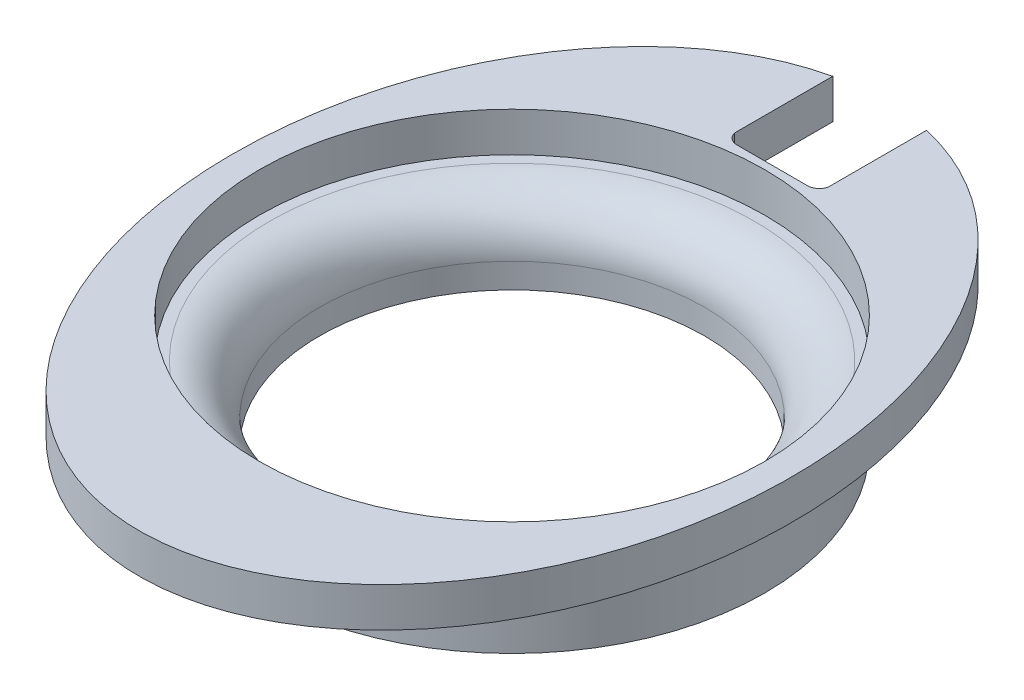
ISO-10303-21;
HEADER;
FILE_DESCRIPTION(('STEP AP214'),'2;1');
FILE_NAME('part.step','',(''),(''),'','','');
FILE_SCHEMA(('AUTOMOTIVE_DESIGN { 1 0 10303 214 1 1 1 1 }'));
ENDSEC;
DATA;
#1=APPLICATION_CONTEXT('core data for automotive mechanical design processes');
#2=APPLICATION_PROTOCOL_DEFINITION('international standard','automotive_design',2000,#1);
#3=PRODUCT_CONTEXT('',#1,'mechanical');
#4=PRODUCT('Part','Part','',(#3));
#5=PRODUCT_RELATED_PRODUCT_CATEGORY('part','',(#4));
#6=PRODUCT_DEFINITION_FORMATION('','',#4);
#7=PRODUCT_DEFINITION_CONTEXT('part definition',#1,'design');
#8=PRODUCT_DEFINITION('design','',#6,#7);
#9=PRODUCT_DEFINITION_SHAPE('','',#8);
#10=(LENGTH_UNIT() NAMED_UNIT(*) SI_UNIT(.MILLI.,.METRE.));
#11=(NAMED_UNIT(*) PLANE_ANGLE_UNIT() SI_UNIT($,.RADIAN.));
#12=(NAMED_UNIT(*) SI_UNIT($,.STERADIAN.) SOLID_ANGLE_UNIT());
#13=UNCERTAINTY_MEASURE_WITH_UNIT(LENGTH_MEASURE(1.E-05),#10,'distance_accuracy_value','');
#14=(GEOMETRIC_REPRESENTATION_CONTEXT(3) GLOBAL_UNCERTAINTY_ASSIGNED_CONTEXT((#13)) GLOBAL_UNIT_ASSIGNED_CONTEXT((#10,
#11,#12)) REPRESENTATION_CONTEXT('',''));
#15=CARTESIAN_POINT('',(0.,0.,0.));
#16=DIRECTION('',(0.,0.,1.));
#17=DIRECTION('',(1.,0.,0.));
#18=AXIS2_PLACEMENT_3D('',#15,#16,#17);
#19=CARTESIAN_POINT('',(0.,-6.,0.));
#20=DIRECTION('',(0.,1.,0.));
#21=DIRECTION('',(0.,0.,1.));
#22=AXIS2_PLACEMENT_3D('',#19,#20,#21);
#23=CYLINDRICAL_SURFACE('',#22,20.335);
#24=CARTESIAN_POINT('',(0.,-6.,0.));
#25=DIRECTION('',(0.,1.,0.));
#26=DIRECTION('',(0.,0.,1.));
#27=AXIS2_PLACEMENT_3D('',#24,#25,#26);
#28=CIRCLE('',#27,20.335);
#29=CARTESIAN_POINT('',(0.,-6.,20.335));
#30=VERTEX_POINT('',#29);
#31=EDGE_CURVE('E63',#30,#30,#28,.T.);
#32=ORIENTED_EDGE('',*,*,#31,.T.);
#33=EDGE_LOOP('',(#32));
#34=FACE_BOUND('',#33,.T.);
#35=CARTESIAN_POINT('',(0.,0.,0.));
#36=DIRECTION('',(0.,1.,0.));
#37=DIRECTION('',(0.,0.,1.));
#38=AXIS2_PLACEMENT_3D('',#35,#36,#37);
#39=CIRCLE('',#38,20.335);
#40=CARTESIAN_POINT('',(0.,0.,20.335));
#41=VERTEX_POINT('',#40);
#42=EDGE_CURVE('E67',#41,#41,#39,.T.);
#43=ORIENTED_EDGE('',*,*,#42,.F.);
#44=EDGE_LOOP('',(#43));
#45=FACE_BOUND('',#44,.T.);
#46=ADVANCED_FACE('F52',(#34,#45),#23,.T.);
#47=CARTESIAN_POINT('',(0.,-6.,0.));
#48=DIRECTION('',(0.,1.,0.));
#49=DIRECTION('',(0.,0.,1.));
#50=AXIS2_PLACEMENT_3D('',#47,#48,#49);
#51=PLANE('',#50);
#52=CARTESIAN_POINT('',(0.,-6.,0.));
#53=DIRECTION('',(0.,1.,0.));
#54=DIRECTION('',(0.,0.,1.));
#55=AXIS2_PLACEMENT_3D('',#52,#53,#54);
#56=CIRCLE('',#55,15.5);
#57=CARTESIAN_POINT('',(0.,-6.,15.5));
#58=VERTEX_POINT('',#57);
#59=EDGE_CURVE('E71',#58,#58,#56,.T.);
#60=ORIENTED_EDGE('',*,*,#59,.T.);
#61=EDGE_LOOP('',(#60));
#62=FACE_BOUND('',#61,.T.);
#63=ORIENTED_EDGE('',*,*,#31,.F.);
#64=EDGE_LOOP('',(#63));
#65=FACE_BOUND('',#64,.T.);
#66=ADVANCED_FACE('F76',(#62,#65),#51,.F.);
#67=CARTESIAN_POINT('',(0.,0.,0.));
#68=DIRECTION('',(0.,1.,0.));
#69=DIRECTION('',(0.,0.,1.));
#70=AXIS2_PLACEMENT_3D('',#67,#68,#69);
#71=PLANE('',#70);
#72=CARTESIAN_POINT('',(0.,0.,0.));
#73=DIRECTION('',(0.,1.,0.));
#74=DIRECTION('',(0.,0.,1.));
#75=AXIS2_PLACEMENT_3D('',#72,#73,#74);
#76=CIRCLE('',#75,19.5);
#77=CARTESIAN_POINT('',(0.,0.,19.5));
#78=VERTEX_POINT('',#77);
#79=EDGE_CURVE('E11',#78,#78,#76,.F.);
#80=ORIENTED_EDGE('',*,*,#79,.T.);
#81=EDGE_LOOP('',(#80));
#82=FACE_BOUND('',#81,.T.);
#83=ORIENTED_EDGE('',*,*,#42,.T.);
#84=EDGE_LOOP('',(#83));
#85=FACE_BOUND('',#84,.T.);
#86=ADVANCED_FACE('F81',(#82,#85),#71,.T.);
#87=CARTESIAN_POINT('',(0.,-6.,0.));
#88=DIRECTION('',(0.,1.,0.));
#89=DIRECTION('',(0.,0.,1.));
#90=AXIS2_PLACEMENT_3D('',#87,#88,#89);
#91=CYLINDRICAL_SURFACE('',#90,15.5);
#92=CARTESIAN_POINT('',(0.,-4.,0.));
#93=DIRECTION('',(0.,1.,0.));
#94=DIRECTION('',(0.,0.,1.));
#95=AXIS2_PLACEMENT_3D('',#92,#93,#94);
#96=CIRCLE('',#95,15.5);
#97=CARTESIAN_POINT('',(0.,-4.,15.5));
#98=VERTEX_POINT('',#97);
#99=EDGE_CURVE('E59',#98,#98,#96,.T.);
#100=ORIENTED_EDGE('',*,*,#99,.T.);
#101=EDGE_LOOP('',(#100));
#102=FACE_BOUND('',#101,.T.);
#103=ORIENTED_EDGE('',*,*,#59,.F.);
#104=EDGE_LOOP('',(#103));
#105=FACE_BOUND('',#104,.T.);
#106=ADVANCED_FACE('F79',(#102,#105),#91,.F.);
#107=CARTESIAN_POINT('',(0.,-4.,0.));
#108=DIRECTION('',(0.,1.,0.));
#109=DIRECTION('',(0.,0.,1.));
#110=AXIS2_PLACEMENT_3D('',#107,#108,#109);
#111=TOROIDAL_SURFACE('',#110,19.5,4.);
#112=ORIENTED_EDGE('',*,*,#79,.F.);
#113=EDGE_LOOP('',(#112));
#114=FACE_BOUND('',#113,.T.);
#115=ORIENTED_EDGE('',*,*,#99,.F.);
#116=EDGE_LOOP('',(#115));
#117=FACE_BOUND('',#116,.T.);
#118=ADVANCED_FACE('F54',(#114,#117),#111,.T.);
#119=CLOSED_SHELL('',(#46,#66,#86,#106,#118));
#120=MANIFOLD_SOLID_BREP('B2',#119);
#121=CARTESIAN_POINT('',(-3.77113801553453,3.175,0.));
#122=DIRECTION('',(1.,0.,0.));
#123=DIRECTION('',(0.,0.,-1.));
#124=AXIS2_PLACEMENT_3D('',#121,#122,#123);
#125=PLANE('',#124);
#126=DIRECTION('',(0.,0.,1.));
#127=VECTOR('',#126,1.);
#128=CARTESIAN_POINT('',(-3.77113801553453,0.,0.));
#129=LINE('',#128,#127);
#130=CARTESIAN_POINT('',(-3.77113801553453,0.,-29.5756211338638));
#131=VERTEX_POINT('',#130);
#132=CARTESIAN_POINT('',(-3.77113801553453,0.,-21.675595911068));
#133=VERTEX_POINT('',#132);
#134=EDGE_CURVE('E223',#131,#133,#129,.T.);
#135=ORIENTED_EDGE('',*,*,#134,.F.);
#136=DIRECTION('',(0.,-1.,0.));
#137=VECTOR('',#136,1.);
#138=CARTESIAN_POINT('',(-3.77113801553453,3.175,-29.5756211338638));
#139=LINE('',#138,#137);
#140=CARTESIAN_POINT('',(-3.77113801553453,3.175,-29.5756211338638));
#141=VERTEX_POINT('',#140);
#142=EDGE_CURVE('E50',#141,#131,#139,.T.);
#143=ORIENTED_EDGE('',*,*,#142,.F.);
#144=DIRECTION('',(0.,0.,1.));
#145=VECTOR('',#144,1.);
#146=CARTESIAN_POINT('',(-3.77113801553453,3.175,0.));
#147=LINE('',#146,#145);
#148=CARTESIAN_POINT('',(-3.77113801553453,3.175,-21.675595911068));
#149=VERTEX_POINT('',#148);
#150=EDGE_CURVE('E260',#141,#149,#147,.T.);
#151=ORIENTED_EDGE('',*,*,#150,.T.);
#152=DIRECTION('',(0.,-1.,0.));
#153=VECTOR('',#152,1.);
#154=CARTESIAN_POINT('',(-3.77113801553453,3.175,-21.675595911068));
#155=LINE('',#154,#153);
#156=EDGE_CURVE('E183',#149,#133,#155,.T.);
#157=ORIENTED_EDGE('',*,*,#156,.T.);
#158=EDGE_LOOP('',(#135,#143,#151,#157));
#159=FACE_BOUND('',#158,.T.);
#160=ADVANCED_FACE('F138',(#159),#125,.T.);
#161=CARTESIAN_POINT('',(0.,3.175,0.));
#162=DIRECTION('',(0.,1.,0.));
#163=DIRECTION('',(0.,0.,1.));
#164=AXIS2_PLACEMENT_3D('',#161,#162,#163);
#165=ELLIPSE('',#164,30.,22.5);
#166=DIRECTION('',(0.,-1.,0.));
#167=VECTOR('',#166,1.);
#168=SURFACE_OF_LINEAR_EXTRUSION('',#165,#167);
#169=CARTESIAN_POINT('',(0.,0.,0.));
#170=DIRECTION('',(0.,1.,0.));
#171=DIRECTION('',(0.,0.,1.));
#172=AXIS2_PLACEMENT_3D('',#169,#170,#171);
#173=ELLIPSE('',#172,30.,22.5);
#174=CARTESIAN_POINT('',(3.77113801553453,0.,-29.5756211338638));
#175=VERTEX_POINT('',#174);
#176=EDGE_CURVE('E226',#131,#175,#173,.T.);
#177=ORIENTED_EDGE('',*,*,#176,.T.);
#178=DIRECTION('',(0.,-1.,0.));
#179=VECTOR('',#178,1.);
#180=CARTESIAN_POINT('',(3.77113801553453,3.175,-29.5756211338638));
#181=LINE('',#180,#179);
#182=CARTESIAN_POINT('',(3.77113801553453,3.175,-29.5756211338638));
#183=VERTEX_POINT('',#182);
#184=EDGE_CURVE('E147',#183,#175,#181,.T.);
#185=ORIENTED_EDGE('',*,*,#184,.F.);
#186=EDGE_CURVE('E257',#141,#183,#165,.T.);
#187=ORIENTED_EDGE('',*,*,#186,.F.);
#188=ORIENTED_EDGE('',*,*,#142,.T.);
#189=EDGE_LOOP('',(#177,#185,#187,#188));
#190=FACE_BOUND('',#189,.T.);
#191=ADVANCED_FACE('F246',(#190),#168,.F.);
#192=CARTESIAN_POINT('',(3.77113801553453,3.175,0.));
#193=DIRECTION('',(1.,0.,0.));
#194=DIRECTION('',(0.,0.,-1.));
#195=AXIS2_PLACEMENT_3D('',#192,#193,#194);
#196=PLANE('',#195);
#197=DIRECTION('',(0.,0.,1.));
#198=VECTOR('',#197,1.);
#199=CARTESIAN_POINT('',(3.77113801553453,0.,0.));
#200=LINE('',#199,#198);
#201=CARTESIAN_POINT('',(3.77113801553453,0.,-21.6755959110681));
#202=VERTEX_POINT('',#201);
#203=EDGE_CURVE('E229',#175,#202,#200,.T.);
#204=ORIENTED_EDGE('',*,*,#203,.T.);
#205=DIRECTION('',(0.,-1.,0.));
#206=VECTOR('',#205,1.);
#207=CARTESIAN_POINT('',(3.77113801553453,3.175,-21.6755959110681));
#208=LINE('',#207,#206);
#209=CARTESIAN_POINT('',(3.77113801553453,3.175,-21.6755959110681));
#210=VERTEX_POINT('',#209);
#211=EDGE_CURVE('E207',#210,#202,#208,.T.);
#212=ORIENTED_EDGE('',*,*,#211,.F.);
#213=DIRECTION('',(0.,0.,1.));
#214=VECTOR('',#213,1.);
#215=CARTESIAN_POINT('',(3.77113801553453,3.175,0.));
#216=LINE('',#215,#214);
#217=EDGE_CURVE('E212',#183,#210,#216,.T.);
#218=ORIENTED_EDGE('',*,*,#217,.F.);
#219=ORIENTED_EDGE('',*,*,#184,.T.);
#220=EDGE_LOOP('',(#204,#212,#218,#219));
#221=FACE_BOUND('',#220,.T.);
#222=ADVANCED_FACE('F243',(#221),#196,.F.);
#223=CARTESIAN_POINT('',(2.83596591607907,3.175,-21.892489273635));
#224=DIRECTION('',(0.,-1.,0.));
#225=DIRECTION('',(0.,0.,-1.));
#226=AXIS2_PLACEMENT_3D('',#223,#224,#225);
#227=CYLINDRICAL_SURFACE('',#226,0.959994576195902);
#228=CARTESIAN_POINT('',(2.83596591607907,0.,-21.892489273635));
#229=DIRECTION('',(0.,1.,0.));
#230=DIRECTION('',(0.,0.,1.));
#231=AXIS2_PLACEMENT_3D('',#228,#229,#230);
#232=CIRCLE('',#231,0.959994576195902);
#233=CARTESIAN_POINT('',(2.83596591607907,0.,-20.9324946974391));
#234=VERTEX_POINT('',#233);
#235=EDGE_CURVE('E202',#234,#202,#232,.T.);
#236=ORIENTED_EDGE('',*,*,#235,.F.);
#237=DIRECTION('',(0.,-1.,0.));
#238=VECTOR('',#237,1.);
#239=CARTESIAN_POINT('',(2.83596591607907,3.175,-20.9324946974391));
#240=LINE('',#239,#238);
#241=CARTESIAN_POINT('',(2.83596591607907,3.175,-20.9324946974391));
#242=VERTEX_POINT('',#241);
#243=EDGE_CURVE('E197',#242,#234,#240,.T.);
#244=ORIENTED_EDGE('',*,*,#243,.F.);
#245=CARTESIAN_POINT('',(2.83596591607907,3.175,-21.892489273635));
#246=DIRECTION('',(0.,1.,0.));
#247=DIRECTION('',(0.,0.,1.));
#248=AXIS2_PLACEMENT_3D('',#245,#246,#247);
#249=CIRCLE('',#248,0.959994576195902);
#250=EDGE_CURVE('E200',#242,#210,#249,.T.);
#251=ORIENTED_EDGE('',*,*,#250,.T.);
#252=ORIENTED_EDGE('',*,*,#211,.T.);
#253=EDGE_LOOP('',(#236,#244,#251,#252));
#254=FACE_BOUND('',#253,.T.);
#255=ADVANCED_FACE('F199',(#254),#227,.F.);
#256=CARTESIAN_POINT('',(0.,3.175,-20.9324946974391));
#257=DIRECTION('',(0.,0.,-1.));
#258=DIRECTION('',(-1.,0.,0.));
#259=AXIS2_PLACEMENT_3D('',#256,#257,#258);
#260=PLANE('',#259);
#261=DIRECTION('',(1.,0.,0.));
#262=VECTOR('',#261,1.);
#263=CARTESIAN_POINT('',(0.,0.,-20.9324946974391));
#264=LINE('',#263,#262);
#265=CARTESIAN_POINT('',(-2.83596591607907,0.,-20.9324946974391));
#266=VERTEX_POINT('',#265);
#267=EDGE_CURVE('E233',#266,#234,#264,.T.);
#268=ORIENTED_EDGE('',*,*,#267,.F.);
#269=DIRECTION('',(0.,-1.,0.));
#270=VECTOR('',#269,1.);
#271=CARTESIAN_POINT('',(-2.83596591607907,3.175,-20.9324946974391));
#272=LINE('',#271,#270);
#273=CARTESIAN_POINT('',(-2.83596591607907,3.175,-20.9324946974391));
#274=VERTEX_POINT('',#273);
#275=EDGE_CURVE('E176',#274,#266,#272,.T.);
#276=ORIENTED_EDGE('',*,*,#275,.F.);
#277=DIRECTION('',(1.,0.,0.));
#278=VECTOR('',#277,1.);
#279=CARTESIAN_POINT('',(0.,3.175,-20.9324946974391));
#280=LINE('',#279,#278);
#281=EDGE_CURVE('E210',#274,#242,#280,.T.);
#282=ORIENTED_EDGE('',*,*,#281,.T.);
#283=ORIENTED_EDGE('',*,*,#243,.T.);
#284=EDGE_LOOP('',(#268,#276,#282,#283));
#285=FACE_BOUND('',#284,.T.);
#286=ADVANCED_FACE('F215',(#285),#260,.T.);
#287=CARTESIAN_POINT('',(0.,3.175,0.));
#288=DIRECTION('',(0.,-1.,0.));
#289=DIRECTION('',(0.,0.,-1.));
#290=AXIS2_PLACEMENT_3D('',#287,#288,#289);
#291=CYLINDRICAL_SURFACE('',#290,20.335);
#292=CARTESIAN_POINT('',(0.,3.175,0.));
#293=DIRECTION('',(0.,1.,0.));
#294=DIRECTION('',(0.,0.,1.));
#295=AXIS2_PLACEMENT_3D('',#292,#293,#294);
#296=CIRCLE('',#295,20.335);
#297=CARTESIAN_POINT('',(0.,3.175,20.335));
#298=VERTEX_POINT('',#297);
#299=EDGE_CURVE('E237',#298,#298,#296,.T.);
#300=ORIENTED_EDGE('',*,*,#299,.T.);
#301=EDGE_LOOP('',(#300));
#302=FACE_BOUND('',#301,.T.);
#303=CARTESIAN_POINT('',(0.,0.,0.));
#304=DIRECTION('',(0.,1.,0.));
#305=DIRECTION('',(0.,0.,1.));
#306=AXIS2_PLACEMENT_3D('',#303,#304,#305);
#307=CIRCLE('',#306,20.335);
#308=CARTESIAN_POINT('',(0.,0.,20.335));
#309=VERTEX_POINT('',#308);
#310=EDGE_CURVE('E220',#309,#309,#307,.T.);
#311=ORIENTED_EDGE('',*,*,#310,.F.);
#312=EDGE_LOOP('',(#311));
#313=FACE_BOUND('',#312,.T.);
#314=ADVANCED_FACE('F140',(#302,#313),#291,.F.);
#315=CARTESIAN_POINT('',(-2.83596591607907,3.175,-21.892489273635));
#316=DIRECTION('',(0.,-1.,0.));
#317=DIRECTION('',(0.,0.,-1.));
#318=AXIS2_PLACEMENT_3D('',#315,#316,#317);
#319=CYLINDRICAL_SURFACE('',#318,0.959994576195901);
#320=CARTESIAN_POINT('',(-2.83596591607907,0.,-21.892489273635));
#321=DIRECTION('',(0.,1.,0.));
#322=DIRECTION('',(0.,0.,1.));
#323=AXIS2_PLACEMENT_3D('',#320,#321,#322);
#324=CIRCLE('',#323,0.959994576195901);
#325=EDGE_CURVE('E235',#266,#133,#324,.F.);
#326=ORIENTED_EDGE('',*,*,#325,.T.);
#327=ORIENTED_EDGE('',*,*,#156,.F.);
#328=CARTESIAN_POINT('',(-2.83596591607907,3.175,-21.892489273635));
#329=DIRECTION('',(0.,1.,0.));
#330=DIRECTION('',(0.,0.,1.));
#331=AXIS2_PLACEMENT_3D('',#328,#329,#330);
#332=CIRCLE('',#331,0.959994576195901);
#333=EDGE_CURVE('E155',#274,#149,#332,.F.);
#334=ORIENTED_EDGE('',*,*,#333,.F.);
#335=ORIENTED_EDGE('',*,*,#275,.T.);
#336=EDGE_LOOP('',(#326,#327,#334,#335));
#337=FACE_BOUND('',#336,.T.);
#338=ADVANCED_FACE('F268',(#337),#319,.F.);
#339=CARTESIAN_POINT('',(0.,3.175,0.));
#340=DIRECTION('',(0.,1.,0.));
#341=DIRECTION('',(0.,0.,1.));
#342=AXIS2_PLACEMENT_3D('',#339,#340,#341);
#343=PLANE('',#342);
#344=ORIENTED_EDGE('',*,*,#299,.F.);
#345=EDGE_LOOP('',(#344));
#346=FACE_BOUND('',#345,.T.);
#347=ORIENTED_EDGE('',*,*,#150,.F.);
#348=ORIENTED_EDGE('',*,*,#186,.T.);
#349=ORIENTED_EDGE('',*,*,#217,.T.);
#350=ORIENTED_EDGE('',*,*,#250,.F.);
#351=ORIENTED_EDGE('',*,*,#281,.F.);
#352=ORIENTED_EDGE('',*,*,#333,.T.);
#353=EDGE_LOOP('',(#347,#348,#349,#350,#351,#352));
#354=FACE_BOUND('',#353,.T.);
#355=ADVANCED_FACE('F209',(#346,#354),#343,.T.);
#356=CARTESIAN_POINT('',(0.,0.,0.));
#357=DIRECTION('',(0.,1.,0.));
#358=DIRECTION('',(0.,0.,1.));
#359=AXIS2_PLACEMENT_3D('',#356,#357,#358);
#360=PLANE('',#359);
#361=ORIENTED_EDGE('',*,*,#310,.T.);
#362=EDGE_LOOP('',(#361));
#363=FACE_BOUND('',#362,.T.);
#364=ORIENTED_EDGE('',*,*,#134,.T.);
#365=ORIENTED_EDGE('',*,*,#325,.F.);
#366=ORIENTED_EDGE('',*,*,#267,.T.);
#367=ORIENTED_EDGE('',*,*,#235,.T.);
#368=ORIENTED_EDGE('',*,*,#203,.F.);
#369=ORIENTED_EDGE('',*,*,#176,.F.);
#370=EDGE_LOOP('',(#364,#365,#366,#367,#368,#369));
#371=FACE_BOUND('',#370,.T.);
#372=ADVANCED_FACE('F248',(#363,#371),#360,.F.);
#373=CLOSED_SHELL('',(#160,#191,#222,#255,#286,#314,#338,#355,#372));
#374=MANIFOLD_SOLID_BREP('B6',#373);
#375=ADVANCED_BREP_SHAPE_REPRESENTATION('',(#18,#120,#374),#14);
#376=SHAPE_DEFINITION_REPRESENTATION(#9,#375);
ENDSEC;
END-ISO-10303-21;
